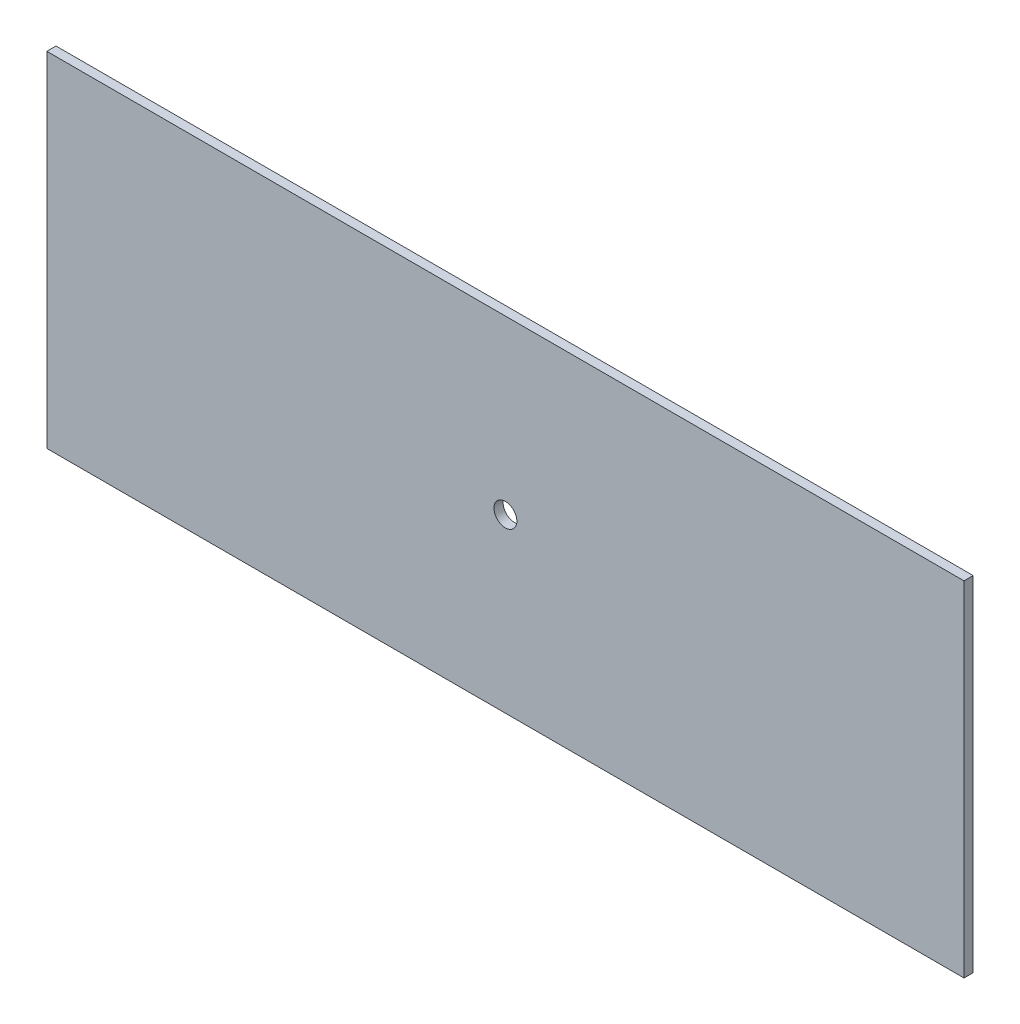
ISO-10303-21;
HEADER;
FILE_DESCRIPTION(('STEP AP214'),'2;1');
FILE_NAME('part.step','',(''),(''),'','','');
FILE_SCHEMA(('AUTOMOTIVE_DESIGN { 1 0 10303 214 1 1 1 1 }'));
ENDSEC;
DATA;
#1=APPLICATION_CONTEXT('core data for automotive mechanical design processes');
#2=APPLICATION_PROTOCOL_DEFINITION('international standard','automotive_design',2000,#1);
#3=PRODUCT_CONTEXT('',#1,'mechanical');
#4=PRODUCT('Part','Part','',(#3));
#5=PRODUCT_RELATED_PRODUCT_CATEGORY('part','',(#4));
#6=PRODUCT_DEFINITION_FORMATION('','',#4);
#7=PRODUCT_DEFINITION_CONTEXT('part definition',#1,'design');
#8=PRODUCT_DEFINITION('design','',#6,#7);
#9=PRODUCT_DEFINITION_SHAPE('','',#8);
#10=(LENGTH_UNIT() NAMED_UNIT(*) SI_UNIT(.MILLI.,.METRE.));
#11=(NAMED_UNIT(*) PLANE_ANGLE_UNIT() SI_UNIT($,.RADIAN.));
#12=(NAMED_UNIT(*) SI_UNIT($,.STERADIAN.) SOLID_ANGLE_UNIT());
#13=UNCERTAINTY_MEASURE_WITH_UNIT(LENGTH_MEASURE(1.E-05),#10,'distance_accuracy_value','');
#14=(GEOMETRIC_REPRESENTATION_CONTEXT(3) GLOBAL_UNCERTAINTY_ASSIGNED_CONTEXT((#13)) GLOBAL_UNIT_ASSIGNED_CONTEXT((#10,
#11,#12)) REPRESENTATION_CONTEXT('',''));
#15=CARTESIAN_POINT('',(0.,0.,0.));
#16=DIRECTION('',(0.,0.,1.));
#17=DIRECTION('',(1.,0.,0.));
#18=AXIS2_PLACEMENT_3D('',#15,#16,#17);
#19=CARTESIAN_POINT('',(0.,0.,4.));
#20=DIRECTION('',(0.,0.,1.));
#21=DIRECTION('',(1.,0.,0.));
#22=AXIS2_PLACEMENT_3D('',#19,#20,#21);
#23=PLANE('',#22);
#24=DIRECTION('',(0.,-1.,0.));
#25=VECTOR('',#24,1.);
#26=CARTESIAN_POINT('',(0.,0.,4.));
#27=LINE('',#26,#25);
#28=CARTESIAN_POINT('',(0.,0.,4.));
#29=VERTEX_POINT('',#28);
#30=CARTESIAN_POINT('',(0.,-150.,4.));
#31=VERTEX_POINT('',#30);
#32=EDGE_CURVE('E89',#29,#31,#27,.T.);
#33=ORIENTED_EDGE('',*,*,#32,.T.);
#34=DIRECTION('',(1.,0.,0.));
#35=VECTOR('',#34,1.);
#36=CARTESIAN_POINT('',(0.,-150.,4.));
#37=LINE('',#36,#35);
#38=CARTESIAN_POINT('',(400.,-150.,4.));
#39=VERTEX_POINT('',#38);
#40=EDGE_CURVE('E84',#31,#39,#37,.T.);
#41=ORIENTED_EDGE('',*,*,#40,.T.);
#42=DIRECTION('',(0.,1.,0.));
#43=VECTOR('',#42,1.);
#44=CARTESIAN_POINT('',(400.,0.,4.));
#45=LINE('',#44,#43);
#46=CARTESIAN_POINT('',(400.,0.,4.));
#47=VERTEX_POINT('',#46);
#48=EDGE_CURVE('E87',#39,#47,#45,.T.);
#49=ORIENTED_EDGE('',*,*,#48,.T.);
#50=DIRECTION('',(-1.,0.,0.));
#51=VECTOR('',#50,1.);
#52=CARTESIAN_POINT('',(0.,0.,4.));
#53=LINE('',#52,#51);
#54=EDGE_CURVE('E54',#47,#29,#53,.T.);
#55=ORIENTED_EDGE('',*,*,#54,.T.);
#56=EDGE_LOOP('',(#33,#41,#49,#55));
#57=FACE_BOUND('',#56,.T.);
#58=CARTESIAN_POINT('',(200.,-75.,4.));
#59=DIRECTION('',(0.,0.,1.));
#60=DIRECTION('',(1.,0.,0.));
#61=AXIS2_PLACEMENT_3D('',#58,#59,#60);
#62=CIRCLE('',#61,5.00000000000002);
#63=CARTESIAN_POINT('',(205.,-75.,4.));
#64=VERTEX_POINT('',#63);
#65=EDGE_CURVE('E104',#64,#64,#62,.T.);
#66=ORIENTED_EDGE('',*,*,#65,.F.);
#67=EDGE_LOOP('',(#66));
#68=FACE_BOUND('',#67,.T.);
#69=ADVANCED_FACE('F37',(#57,#68),#23,.T.);
#70=CARTESIAN_POINT('',(0.,0.,0.));
#71=DIRECTION('',(0.,0.,1.));
#72=DIRECTION('',(1.,0.,0.));
#73=AXIS2_PLACEMENT_3D('',#70,#71,#72);
#74=PLANE('',#73);
#75=DIRECTION('',(0.,-1.,0.));
#76=VECTOR('',#75,1.);
#77=CARTESIAN_POINT('',(0.,0.,0.));
#78=LINE('',#77,#76);
#79=CARTESIAN_POINT('',(0.,0.,0.));
#80=VERTEX_POINT('',#79);
#81=CARTESIAN_POINT('',(0.,-150.,0.));
#82=VERTEX_POINT('',#81);
#83=EDGE_CURVE('E101',#80,#82,#78,.T.);
#84=ORIENTED_EDGE('',*,*,#83,.F.);
#85=DIRECTION('',(-1.,0.,0.));
#86=VECTOR('',#85,1.);
#87=CARTESIAN_POINT('',(0.,0.,0.));
#88=LINE('',#87,#86);
#89=CARTESIAN_POINT('',(400.,0.,0.));
#90=VERTEX_POINT('',#89);
#91=EDGE_CURVE('E77',#90,#80,#88,.T.);
#92=ORIENTED_EDGE('',*,*,#91,.F.);
#93=DIRECTION('',(0.,1.,0.));
#94=VECTOR('',#93,1.);
#95=CARTESIAN_POINT('',(400.,0.,0.));
#96=LINE('',#95,#94);
#97=CARTESIAN_POINT('',(400.,-150.,0.));
#98=VERTEX_POINT('',#97);
#99=EDGE_CURVE('E71',#98,#90,#96,.T.);
#100=ORIENTED_EDGE('',*,*,#99,.F.);
#101=DIRECTION('',(1.,0.,0.));
#102=VECTOR('',#101,1.);
#103=CARTESIAN_POINT('',(0.,-150.,0.));
#104=LINE('',#103,#102);
#105=EDGE_CURVE('E93',#82,#98,#104,.T.);
#106=ORIENTED_EDGE('',*,*,#105,.F.);
#107=EDGE_LOOP('',(#84,#92,#100,#106));
#108=FACE_BOUND('',#107,.T.);
#109=CARTESIAN_POINT('',(200.,-75.,0.));
#110=DIRECTION('',(0.,0.,1.));
#111=DIRECTION('',(1.,0.,0.));
#112=AXIS2_PLACEMENT_3D('',#109,#110,#111);
#113=CIRCLE('',#112,5.00000000000002);
#114=CARTESIAN_POINT('',(205.,-75.,0.));
#115=VERTEX_POINT('',#114);
#116=EDGE_CURVE('E116',#115,#115,#113,.T.);
#117=ORIENTED_EDGE('',*,*,#116,.T.);
#118=EDGE_LOOP('',(#117));
#119=FACE_BOUND('',#118,.T.);
#120=ADVANCED_FACE('F112',(#108,#119),#74,.F.);
#121=CARTESIAN_POINT('',(0.,0.,4.));
#122=DIRECTION('',(1.,0.,0.));
#123=DIRECTION('',(0.,1.,0.));
#124=AXIS2_PLACEMENT_3D('',#121,#122,#123);
#125=PLANE('',#124);
#126=ORIENTED_EDGE('',*,*,#83,.T.);
#127=DIRECTION('',(0.,0.,-1.));
#128=VECTOR('',#127,1.);
#129=CARTESIAN_POINT('',(0.,-150.,4.));
#130=LINE('',#129,#128);
#131=EDGE_CURVE('E11',#31,#82,#130,.T.);
#132=ORIENTED_EDGE('',*,*,#131,.F.);
#133=ORIENTED_EDGE('',*,*,#32,.F.);
#134=DIRECTION('',(0.,0.,-1.));
#135=VECTOR('',#134,1.);
#136=CARTESIAN_POINT('',(0.,0.,4.));
#137=LINE('',#136,#135);
#138=EDGE_CURVE('E97',#29,#80,#137,.T.);
#139=ORIENTED_EDGE('',*,*,#138,.T.);
#140=EDGE_LOOP('',(#126,#132,#133,#139));
#141=FACE_BOUND('',#140,.T.);
#142=ADVANCED_FACE('F39',(#141),#125,.F.);
#143=CARTESIAN_POINT('',(0.,-150.,4.));
#144=DIRECTION('',(0.,1.,0.));
#145=DIRECTION('',(0.,0.,1.));
#146=AXIS2_PLACEMENT_3D('',#143,#144,#145);
#147=PLANE('',#146);
#148=ORIENTED_EDGE('',*,*,#105,.T.);
#149=DIRECTION('',(0.,0.,-1.));
#150=VECTOR('',#149,1.);
#151=CARTESIAN_POINT('',(400.,-150.,4.));
#152=LINE('',#151,#150);
#153=EDGE_CURVE('E46',#39,#98,#152,.T.);
#154=ORIENTED_EDGE('',*,*,#153,.F.);
#155=ORIENTED_EDGE('',*,*,#40,.F.);
#156=ORIENTED_EDGE('',*,*,#131,.T.);
#157=EDGE_LOOP('',(#148,#154,#155,#156));
#158=FACE_BOUND('',#157,.T.);
#159=ADVANCED_FACE('F92',(#158),#147,.F.);
#160=CARTESIAN_POINT('',(400.,0.,4.));
#161=DIRECTION('',(-1.,0.,0.));
#162=DIRECTION('',(0.,0.,1.));
#163=AXIS2_PLACEMENT_3D('',#160,#161,#162);
#164=PLANE('',#163);
#165=ORIENTED_EDGE('',*,*,#99,.T.);
#166=DIRECTION('',(0.,0.,-1.));
#167=VECTOR('',#166,1.);
#168=CARTESIAN_POINT('',(400.,0.,4.));
#169=LINE('',#168,#167);
#170=EDGE_CURVE('E94',#47,#90,#169,.T.);
#171=ORIENTED_EDGE('',*,*,#170,.F.);
#172=ORIENTED_EDGE('',*,*,#48,.F.);
#173=ORIENTED_EDGE('',*,*,#153,.T.);
#174=EDGE_LOOP('',(#165,#171,#172,#173));
#175=FACE_BOUND('',#174,.T.);
#176=ADVANCED_FACE('F95',(#175),#164,.F.);
#177=CARTESIAN_POINT('',(0.,0.,4.));
#178=DIRECTION('',(0.,-1.,0.));
#179=DIRECTION('',(0.,0.,-1.));
#180=AXIS2_PLACEMENT_3D('',#177,#178,#179);
#181=PLANE('',#180);
#182=ORIENTED_EDGE('',*,*,#91,.T.);
#183=ORIENTED_EDGE('',*,*,#138,.F.);
#184=ORIENTED_EDGE('',*,*,#54,.F.);
#185=ORIENTED_EDGE('',*,*,#170,.T.);
#186=EDGE_LOOP('',(#182,#183,#184,#185));
#187=FACE_BOUND('',#186,.T.);
#188=ADVANCED_FACE('F109',(#187),#181,.F.);
#189=CARTESIAN_POINT('',(200.,-75.,4.));
#190=DIRECTION('',(0.,0.,-1.));
#191=DIRECTION('',(-1.,0.,0.));
#192=AXIS2_PLACEMENT_3D('',#189,#190,#191);
#193=CYLINDRICAL_SURFACE('',#192,5.00000000000002);
#194=ORIENTED_EDGE('',*,*,#65,.T.);
#195=EDGE_LOOP('',(#194));
#196=FACE_BOUND('',#195,.T.);
#197=ORIENTED_EDGE('',*,*,#116,.F.);
#198=EDGE_LOOP('',(#197));
#199=FACE_BOUND('',#198,.T.);
#200=ADVANCED_FACE('F122',(#196,#199),#193,.F.);
#201=CLOSED_SHELL('',(#69,#120,#142,#159,#176,#188,#200));
#202=MANIFOLD_SOLID_BREP('B2',#201);
#203=ADVANCED_BREP_SHAPE_REPRESENTATION('',(#18,#202),#14);
#204=SHAPE_DEFINITION_REPRESENTATION(#9,#203);
ENDSEC;
END-ISO-10303-21;
